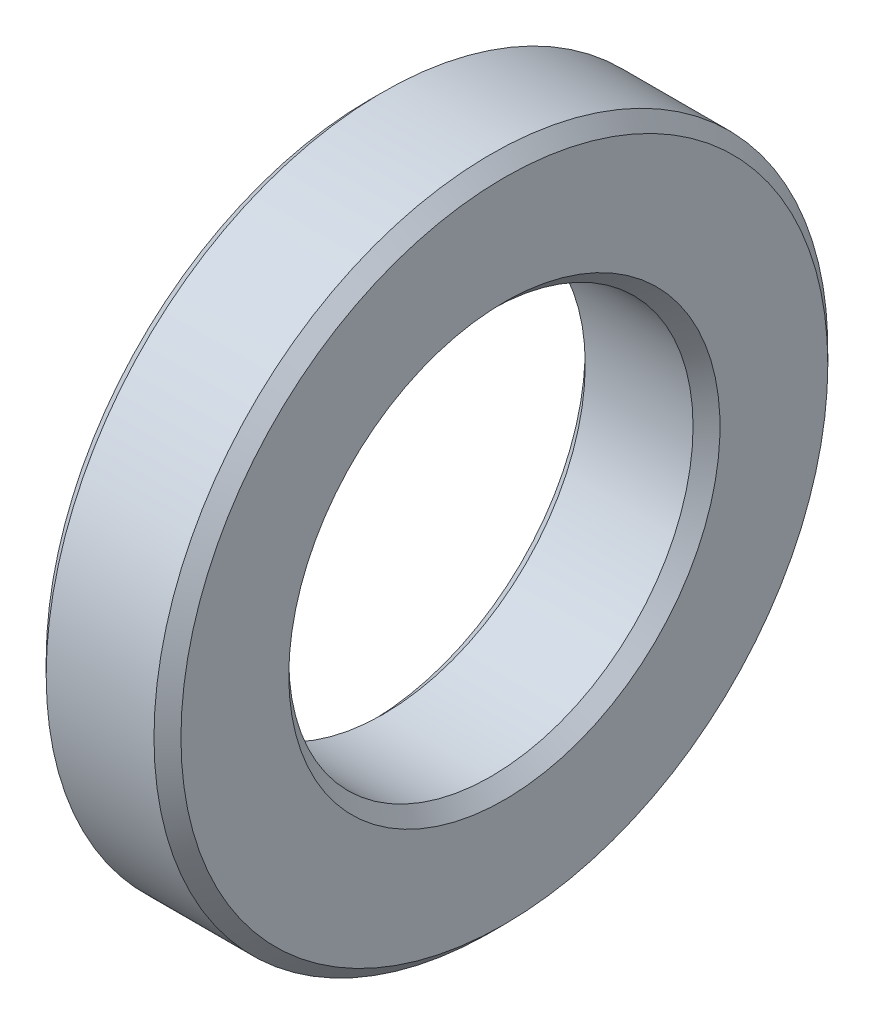
ISO-10303-21;
HEADER;
FILE_DESCRIPTION(('STEP AP214'),'2;1');
FILE_NAME('part.step','',(''),(''),'','','');
FILE_SCHEMA(('AUTOMOTIVE_DESIGN { 1 0 10303 214 1 1 1 1 }'));
ENDSEC;
DATA;
#1=APPLICATION_CONTEXT('core data for automotive mechanical design processes');
#2=APPLICATION_PROTOCOL_DEFINITION('international standard','automotive_design',2000,#1);
#3=PRODUCT_CONTEXT('',#1,'mechanical');
#4=PRODUCT('Part','Part','',(#3));
#5=PRODUCT_RELATED_PRODUCT_CATEGORY('part','',(#4));
#6=PRODUCT_DEFINITION_FORMATION('','',#4);
#7=PRODUCT_DEFINITION_CONTEXT('part definition',#1,'design');
#8=PRODUCT_DEFINITION('design','',#6,#7);
#9=PRODUCT_DEFINITION_SHAPE('','',#8);
#10=(LENGTH_UNIT() NAMED_UNIT(*) SI_UNIT(.MILLI.,.METRE.));
#11=(NAMED_UNIT(*) PLANE_ANGLE_UNIT() SI_UNIT($,.RADIAN.));
#12=(NAMED_UNIT(*) SI_UNIT($,.STERADIAN.) SOLID_ANGLE_UNIT());
#13=UNCERTAINTY_MEASURE_WITH_UNIT(LENGTH_MEASURE(1.E-05),#10,'distance_accuracy_value','');
#14=(GEOMETRIC_REPRESENTATION_CONTEXT(3) GLOBAL_UNCERTAINTY_ASSIGNED_CONTEXT((#13)) GLOBAL_UNIT_ASSIGNED_CONTEXT((#10,
#11,#12)) REPRESENTATION_CONTEXT('',''));
#15=CARTESIAN_POINT('',(0.,0.,0.));
#16=DIRECTION('',(0.,0.,1.));
#17=DIRECTION('',(1.,0.,0.));
#18=AXIS2_PLACEMENT_3D('',#15,#16,#17);
#19=CARTESIAN_POINT('',(0.5,0.,0.));
#20=DIRECTION('',(-1.,0.,0.));
#21=DIRECTION('',(0.,0.,1.));
#22=AXIS2_PLACEMENT_3D('',#19,#20,#21);
#23=CONICAL_SURFACE('',#22,7.5,0.785398163397448);
#24=CARTESIAN_POINT('',(0.,0.,0.));
#25=DIRECTION('',(-1.,0.,0.));
#26=DIRECTION('',(0.,0.,1.));
#27=AXIS2_PLACEMENT_3D('',#24,#25,#26);
#28=CIRCLE('',#27,8.);
#29=CARTESIAN_POINT('',(0.,0.,8.));
#30=VERTEX_POINT('',#29);
#31=EDGE_CURVE('E5',#30,#30,#28,.T.);
#32=ORIENTED_EDGE('',*,*,#31,.T.);
#33=EDGE_LOOP('',(#32));
#34=FACE_BOUND('',#33,.T.);
#35=CARTESIAN_POINT('',(0.5,0.,0.));
#36=DIRECTION('',(-1.,0.,0.));
#37=DIRECTION('',(0.,0.,1.));
#38=AXIS2_PLACEMENT_3D('',#35,#36,#37);
#39=CIRCLE('',#38,7.5);
#40=CARTESIAN_POINT('',(0.5,0.,7.5));
#41=VERTEX_POINT('',#40);
#42=EDGE_CURVE('E9',#41,#41,#39,.T.);
#43=ORIENTED_EDGE('',*,*,#42,.F.);
#44=EDGE_LOOP('',(#43));
#45=FACE_BOUND('',#44,.T.);
#46=ADVANCED_FACE('F13',(#34,#45),#23,.F.);
#47=CARTESIAN_POINT('',(0.,-8.,0.));
#48=DIRECTION('',(-1.,0.,0.));
#49=DIRECTION('',(0.,0.,1.));
#50=AXIS2_PLACEMENT_3D('',#47,#48,#49);
#51=PLANE('',#50);
#52=CARTESIAN_POINT('',(0.,0.,0.));
#53=DIRECTION('',(-1.,0.,0.));
#54=DIRECTION('',(0.,0.,1.));
#55=AXIS2_PLACEMENT_3D('',#52,#53,#54);
#56=CIRCLE('',#55,12.);
#57=CARTESIAN_POINT('',(0.,0.,12.));
#58=VERTEX_POINT('',#57);
#59=EDGE_CURVE('E24',#58,#58,#56,.T.);
#60=ORIENTED_EDGE('',*,*,#59,.T.);
#61=EDGE_LOOP('',(#60));
#62=FACE_BOUND('',#61,.T.);
#63=ORIENTED_EDGE('',*,*,#31,.F.);
#64=EDGE_LOOP('',(#63));
#65=FACE_BOUND('',#64,.T.);
#66=ADVANCED_FACE('F30',(#62,#65),#51,.T.);
#67=CARTESIAN_POINT('',(-3.,0.,0.));
#68=DIRECTION('',(-1.,0.,0.));
#69=DIRECTION('',(0.,0.,1.));
#70=AXIS2_PLACEMENT_3D('',#67,#68,#69);
#71=CYLINDRICAL_SURFACE('',#70,7.5);
#72=ORIENTED_EDGE('',*,*,#42,.T.);
#73=EDGE_LOOP('',(#72));
#74=FACE_BOUND('',#73,.T.);
#75=CARTESIAN_POINT('',(4.5,0.,0.));
#76=DIRECTION('',(-1.,0.,0.));
#77=DIRECTION('',(0.,0.,1.));
#78=AXIS2_PLACEMENT_3D('',#75,#76,#77);
#79=CIRCLE('',#78,7.5);
#80=CARTESIAN_POINT('',(4.5,0.,7.5));
#81=VERTEX_POINT('',#80);
#82=EDGE_CURVE('E39',#81,#81,#79,.T.);
#83=ORIENTED_EDGE('',*,*,#82,.F.);
#84=EDGE_LOOP('',(#83));
#85=FACE_BOUND('',#84,.T.);
#86=ADVANCED_FACE('F43',(#74,#85),#71,.F.);
#87=CARTESIAN_POINT('',(0.,0.,0.));
#88=DIRECTION('',(1.,0.,0.));
#89=DIRECTION('',(0.,0.,-1.));
#90=AXIS2_PLACEMENT_3D('',#87,#88,#89);
#91=CONICAL_SURFACE('',#90,12.,0.785398163397449);
#92=CARTESIAN_POINT('',(0.5,0.,0.));
#93=DIRECTION('',(-1.,0.,0.));
#94=DIRECTION('',(0.,0.,1.));
#95=AXIS2_PLACEMENT_3D('',#92,#93,#94);
#96=CIRCLE('',#95,12.5);
#97=CARTESIAN_POINT('',(0.5,0.,12.5));
#98=VERTEX_POINT('',#97);
#99=EDGE_CURVE('E50',#98,#98,#96,.T.);
#100=ORIENTED_EDGE('',*,*,#99,.T.);
#101=EDGE_LOOP('',(#100));
#102=FACE_BOUND('',#101,.T.);
#103=ORIENTED_EDGE('',*,*,#59,.F.);
#104=EDGE_LOOP('',(#103));
#105=FACE_BOUND('',#104,.T.);
#106=ADVANCED_FACE('F56',(#102,#105),#91,.T.);
#107=CARTESIAN_POINT('',(5.,0.,0.));
#108=DIRECTION('',(1.,0.,0.));
#109=DIRECTION('',(0.,0.,-1.));
#110=AXIS2_PLACEMENT_3D('',#107,#108,#109);
#111=CONICAL_SURFACE('',#110,8.,0.785398163397449);
#112=ORIENTED_EDGE('',*,*,#82,.T.);
#113=EDGE_LOOP('',(#112));
#114=FACE_BOUND('',#113,.T.);
#115=CARTESIAN_POINT('',(5.,0.,0.));
#116=DIRECTION('',(-1.,0.,0.));
#117=DIRECTION('',(0.,0.,1.));
#118=AXIS2_PLACEMENT_3D('',#115,#116,#117);
#119=CIRCLE('',#118,8.);
#120=CARTESIAN_POINT('',(5.,0.,8.));
#121=VERTEX_POINT('',#120);
#122=EDGE_CURVE('E65',#121,#121,#119,.T.);
#123=ORIENTED_EDGE('',*,*,#122,.F.);
#124=EDGE_LOOP('',(#123));
#125=FACE_BOUND('',#124,.T.);
#126=ADVANCED_FACE('F69',(#114,#125),#111,.F.);
#127=CARTESIAN_POINT('',(-3.,0.,0.));
#128=DIRECTION('',(-1.,0.,0.));
#129=DIRECTION('',(0.,0.,1.));
#130=AXIS2_PLACEMENT_3D('',#127,#128,#129);
#131=CYLINDRICAL_SURFACE('',#130,12.5);
#132=CARTESIAN_POINT('',(4.5,0.,0.));
#133=DIRECTION('',(-1.,0.,0.));
#134=DIRECTION('',(0.,0.,1.));
#135=AXIS2_PLACEMENT_3D('',#132,#133,#134);
#136=CIRCLE('',#135,12.5);
#137=CARTESIAN_POINT('',(4.5,0.,12.5));
#138=VERTEX_POINT('',#137);
#139=EDGE_CURVE('E76',#138,#138,#136,.T.);
#140=ORIENTED_EDGE('',*,*,#139,.T.);
#141=EDGE_LOOP('',(#140));
#142=FACE_BOUND('',#141,.T.);
#143=ORIENTED_EDGE('',*,*,#99,.F.);
#144=EDGE_LOOP('',(#143));
#145=FACE_BOUND('',#144,.T.);
#146=ADVANCED_FACE('F82',(#142,#145),#131,.T.);
#147=CARTESIAN_POINT('',(5.,-12.,0.));
#148=DIRECTION('',(1.,0.,0.));
#149=DIRECTION('',(0.,0.,-1.));
#150=AXIS2_PLACEMENT_3D('',#147,#148,#149);
#151=PLANE('',#150);
#152=ORIENTED_EDGE('',*,*,#122,.T.);
#153=EDGE_LOOP('',(#152));
#154=FACE_BOUND('',#153,.T.);
#155=CARTESIAN_POINT('',(5.,0.,0.));
#156=DIRECTION('',(-1.,0.,0.));
#157=DIRECTION('',(0.,0.,1.));
#158=AXIS2_PLACEMENT_3D('',#155,#156,#157);
#159=CIRCLE('',#158,12.);
#160=CARTESIAN_POINT('',(5.,0.,12.));
#161=VERTEX_POINT('',#160);
#162=EDGE_CURVE('E91',#161,#161,#159,.T.);
#163=ORIENTED_EDGE('',*,*,#162,.F.);
#164=EDGE_LOOP('',(#163));
#165=FACE_BOUND('',#164,.T.);
#166=ADVANCED_FACE('F95',(#154,#165),#151,.T.);
#167=CARTESIAN_POINT('',(4.5,0.,0.));
#168=DIRECTION('',(-1.,0.,0.));
#169=DIRECTION('',(0.,0.,1.));
#170=AXIS2_PLACEMENT_3D('',#167,#168,#169);
#171=CONICAL_SURFACE('',#170,12.5,0.785398163397449);
#172=ORIENTED_EDGE('',*,*,#162,.T.);
#173=EDGE_LOOP('',(#172));
#174=FACE_BOUND('',#173,.T.);
#175=ORIENTED_EDGE('',*,*,#139,.F.);
#176=EDGE_LOOP('',(#175));
#177=FACE_BOUND('',#176,.T.);
#178=ADVANCED_FACE('F106',(#174,#177),#171,.T.);
#179=CLOSED_SHELL('',(#46,#66,#86,#106,#126,#146,#166,#178));
#180=MANIFOLD_SOLID_BREP('B1',#179);
#181=ADVANCED_BREP_SHAPE_REPRESENTATION('',(#18,#180),#14);
#182=SHAPE_DEFINITION_REPRESENTATION(#9,#181);
ENDSEC;
END-ISO-10303-21;
